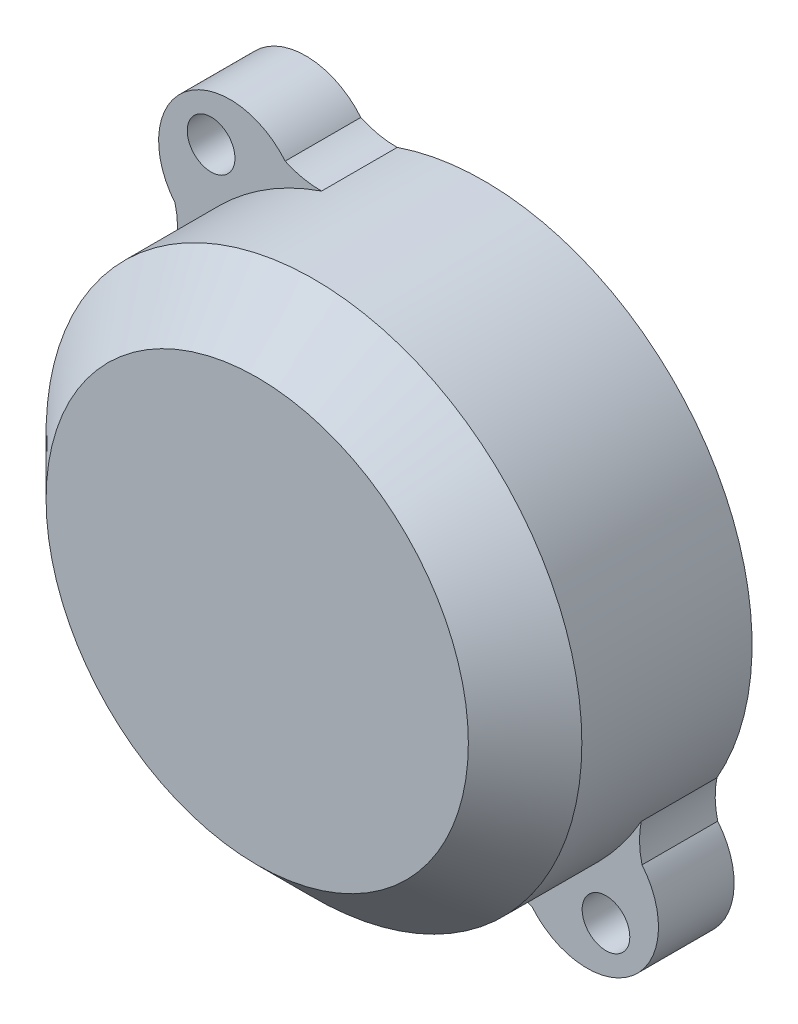
ISO-10303-21;
HEADER;
FILE_DESCRIPTION(('STEP AP214'),'2;1');
FILE_NAME('part.step','',(''),(''),'','','');
FILE_SCHEMA(('AUTOMOTIVE_DESIGN { 1 0 10303 214 1 1 1 1 }'));
ENDSEC;
DATA;
#1=APPLICATION_CONTEXT('core data for automotive mechanical design processes');
#2=APPLICATION_PROTOCOL_DEFINITION('international standard','automotive_design',2000,#1);
#3=PRODUCT_CONTEXT('',#1,'mechanical');
#4=PRODUCT('Part','Part','',(#3));
#5=PRODUCT_RELATED_PRODUCT_CATEGORY('part','',(#4));
#6=PRODUCT_DEFINITION_FORMATION('','',#4);
#7=PRODUCT_DEFINITION_CONTEXT('part definition',#1,'design');
#8=PRODUCT_DEFINITION('design','',#6,#7);
#9=PRODUCT_DEFINITION_SHAPE('','',#8);
#10=(LENGTH_UNIT() NAMED_UNIT(*) SI_UNIT(.MILLI.,.METRE.));
#11=(NAMED_UNIT(*) PLANE_ANGLE_UNIT() SI_UNIT($,.RADIAN.));
#12=(NAMED_UNIT(*) SI_UNIT($,.STERADIAN.) SOLID_ANGLE_UNIT());
#13=UNCERTAINTY_MEASURE_WITH_UNIT(LENGTH_MEASURE(1.E-05),#10,'distance_accuracy_value','');
#14=(GEOMETRIC_REPRESENTATION_CONTEXT(3) GLOBAL_UNCERTAINTY_ASSIGNED_CONTEXT((#13)) GLOBAL_UNIT_ASSIGNED_CONTEXT((#10,
#11,#12)) REPRESENTATION_CONTEXT('',''));
#15=CARTESIAN_POINT('',(0.,0.,0.));
#16=DIRECTION('',(0.,0.,1.));
#17=DIRECTION('',(1.,0.,0.));
#18=AXIS2_PLACEMENT_3D('',#15,#16,#17);
#19=CARTESIAN_POINT('',(-167.581326330583,1325.78958983772,-940.799406281006));
#20=DIRECTION('',(0.,0.,-1.));
#21=DIRECTION('',(-1.,0.,0.));
#22=AXIS2_PLACEMENT_3D('',#19,#20,#21);
#23=CYLINDRICAL_SURFACE('',#22,22.4820000000628);
#24=CARTESIAN_POINT('',(-167.581326330583,1325.78958983772,-945.561906281006));
#25=DIRECTION('',(0.,0.,1.));
#26=DIRECTION('',(1.,0.,0.));
#27=AXIS2_PLACEMENT_3D('',#24,#25,#26);
#28=CIRCLE('',#27,22.4820000000628);
#29=CARTESIAN_POINT('',(-145.09932633052,1325.78958983772,-945.561906281006));
#30=VERTEX_POINT('',#29);
#31=EDGE_CURVE('E11',#30,#30,#28,.F.);
#32=ORIENTED_EDGE('',*,*,#31,.T.);
#33=EDGE_LOOP('',(#32));
#34=FACE_BOUND('',#33,.T.);
#35=CARTESIAN_POINT('',(-167.581326330583,1325.78958983772,-959.849406281006));
#36=DIRECTION('',(0.,0.,1.));
#37=DIRECTION('',(1.,0.,0.));
#38=AXIS2_PLACEMENT_3D('',#35,#36,#37);
#39=CIRCLE('',#38,22.4820000000628);
#40=CARTESIAN_POINT('',(-187.111667421784,1336.9253924969,-959.849406281006));
#41=VERTEX_POINT('',#40);
#42=CARTESIAN_POINT('',(-160.283886838188,1304.52488431759,-959.849406281006));
#43=VERTEX_POINT('',#42);
#44=EDGE_CURVE('E360',#41,#43,#39,.T.);
#45=ORIENTED_EDGE('',*,*,#44,.T.);
#46=DIRECTION('',(0.,0.,-1.));
#47=VECTOR('',#46,1.);
#48=CARTESIAN_POINT('',(-160.283886838188,1304.52488431759,-953.499406281006));
#49=LINE('',#48,#47);
#50=CARTESIAN_POINT('',(-160.283886838188,1304.52488431759,-953.499406281006));
#51=VERTEX_POINT('',#50);
#52=EDGE_CURVE('E304',#51,#43,#49,.T.);
#53=ORIENTED_EDGE('',*,*,#52,.F.);
#54=CARTESIAN_POINT('',(-167.581326330583,1325.78958983772,-953.499406281006));
#55=DIRECTION('',(0.,0.,1.));
#56=DIRECTION('',(1.,0.,0.));
#57=AXIS2_PLACEMENT_3D('',#54,#55,#56);
#58=CIRCLE('',#57,22.4820000000628);
#59=CARTESIAN_POINT('',(-148.050985239385,1314.65378717853,-953.499406281006));
#60=VERTEX_POINT('',#59);
#61=EDGE_CURVE('E71',#51,#60,#58,.T.);
#62=ORIENTED_EDGE('',*,*,#61,.T.);
#63=DIRECTION('',(0.,0.,-1.));
#64=VECTOR('',#63,1.);
#65=CARTESIAN_POINT('',(-148.050985239385,1314.65378717853,-953.499406281006));
#66=LINE('',#65,#64);
#67=CARTESIAN_POINT('',(-148.050985239385,1314.65378717853,-959.849406281006));
#68=VERTEX_POINT('',#67);
#69=EDGE_CURVE('E316',#60,#68,#66,.T.);
#70=ORIENTED_EDGE('',*,*,#69,.T.);
#71=CARTESIAN_POINT('',(-174.878765822976,1347.05429535784,-959.849406281006));
#72=VERTEX_POINT('',#71);
#73=EDGE_CURVE('E359',#68,#72,#39,.T.);
#74=ORIENTED_EDGE('',*,*,#73,.T.);
#75=DIRECTION('',(0.,0.,-1.));
#76=VECTOR('',#75,1.);
#77=CARTESIAN_POINT('',(-174.878765822976,1347.05429535784,-953.499406281006));
#78=LINE('',#77,#76);
#79=CARTESIAN_POINT('',(-174.878765822976,1347.05429535784,-953.499406281006));
#80=VERTEX_POINT('',#79);
#81=EDGE_CURVE('E339',#80,#72,#78,.T.);
#82=ORIENTED_EDGE('',*,*,#81,.F.);
#83=CARTESIAN_POINT('',(-167.581326330583,1325.78958983772,-953.499406281006));
#84=DIRECTION('',(0.,0.,1.));
#85=DIRECTION('',(1.,0.,0.));
#86=AXIS2_PLACEMENT_3D('',#83,#84,#85);
#87=CIRCLE('',#86,22.4820000000628);
#88=CARTESIAN_POINT('',(-187.111667421784,1336.9253924969,-953.499406281006));
#89=VERTEX_POINT('',#88);
#90=EDGE_CURVE('E334',#80,#89,#87,.T.);
#91=ORIENTED_EDGE('',*,*,#90,.T.);
#92=DIRECTION('',(0.,0.,-1.));
#93=VECTOR('',#92,1.);
#94=CARTESIAN_POINT('',(-187.111667421784,1336.9253924969,-953.499406281006));
#95=LINE('',#94,#93);
#96=EDGE_CURVE('E352',#89,#41,#95,.T.);
#97=ORIENTED_EDGE('',*,*,#96,.T.);
#98=EDGE_LOOP('',(#45,#53,#62,#70,#74,#82,#91,#97));
#99=FACE_BOUND('',#98,.T.);
#100=ADVANCED_FACE('F47',(#34,#99),#23,.T.);
#101=CARTESIAN_POINT('',(0.,0.,-940.799406281006));
#102=DIRECTION('',(0.,0.,1.));
#103=DIRECTION('',(1.,0.,0.));
#104=AXIS2_PLACEMENT_3D('',#101,#102,#103);
#105=PLANE('',#104);
#106=CARTESIAN_POINT('',(-167.581326330583,1325.78958983772,-940.799406281006));
#107=DIRECTION('',(0.,0.,1.));
#108=DIRECTION('',(1.,0.,0.));
#109=AXIS2_PLACEMENT_3D('',#106,#107,#108);
#110=CIRCLE('',#109,17.7195000000628);
#111=CARTESIAN_POINT('',(-149.86182633052,1325.78958983772,-940.799406281006));
#112=VERTEX_POINT('',#111);
#113=EDGE_CURVE('E56',#112,#112,#110,.T.);
#114=ORIENTED_EDGE('',*,*,#113,.T.);
#115=EDGE_LOOP('',(#114));
#116=FACE_BOUND('',#115,.T.);
#117=ADVANCED_FACE('F364',(#116),#105,.T.);
#118=CARTESIAN_POINT('',(0.,0.,-959.849406281006));
#119=DIRECTION('',(0.,0.,1.));
#120=DIRECTION('',(1.,0.,0.));
#121=AXIS2_PLACEMENT_3D('',#118,#119,#120);
#122=PLANE('',#121);
#123=CARTESIAN_POINT('',(-182.557185770616,1343.87626885937,-959.849406281006));
#124=DIRECTION('',(0.,0.,1.));
#125=DIRECTION('',(1.,0.,0.));
#126=AXIS2_PLACEMENT_3D('',#123,#124,#125);
#127=CIRCLE('',#126,3.99999993600104);
#128=CARTESIAN_POINT('',(-185.382666181313,1341.04489817775,-959.849406281006));
#129=VERTEX_POINT('',#128);
#130=CARTESIAN_POINT('',(-186.281027508607,1342.41578873339,-959.849406281006));
#131=VERTEX_POINT('',#130);
#132=EDGE_CURVE('E263',#129,#131,#127,.F.);
#133=ORIENTED_EDGE('',*,*,#132,.F.);
#134=CARTESIAN_POINT('',(-193.962425640702,1338.3415036593,-959.849406281006));
#135=DIRECTION('',(0.,0.,1.));
#136=DIRECTION('',(1.,0.,0.));
#137=AXIS2_PLACEMENT_3D('',#134,#135,#136);
#138=CIRCLE('',#137,8.99558860238387);
#139=CARTESIAN_POINT('',(-185.229107010828,1336.18517344052,-959.849406281006));
#140=VERTEX_POINT('',#139);
#141=EDGE_CURVE('E260',#129,#140,#138,.F.);
#142=ORIENTED_EDGE('',*,*,#141,.T.);
#143=CARTESIAN_POINT('',(-167.581326330583,1325.78958983772,-959.849406281006));
#144=DIRECTION('',(0.,0.,1.));
#145=DIRECTION('',(1.,0.,0.));
#146=AXIS2_PLACEMENT_3D('',#143,#144,#145);
#147=CIRCLE('',#146,20.4819999360628);
#148=CARTESIAN_POINT('',(-160.659967324363,1306.5124761822,-959.849406281006));
#149=VERTEX_POINT('',#148);
#150=EDGE_CURVE('E258',#140,#149,#147,.T.);
#151=ORIENTED_EDGE('',*,*,#150,.T.);
#152=CARTESIAN_POINT('',(-160.170477426892,1297.53021511142,-959.849406281006));
#153=DIRECTION('',(0.,0.,1.));
#154=DIRECTION('',(1.,0.,0.));
#155=AXIS2_PLACEMENT_3D('',#152,#153,#154);
#156=CIRCLE('',#155,8.99558860238443);
#157=CARTESIAN_POINT('',(-155.91417409477,1305.45514389648,-959.849406281006));
#158=VERTEX_POINT('',#157);
#159=EDGE_CURVE('E194',#158,#149,#156,.T.);
#160=ORIENTED_EDGE('',*,*,#159,.F.);
#161=CARTESIAN_POINT('',(-152.605466890552,1307.70291081606,-959.849406281006));
#162=DIRECTION('',(0.,0.,1.));
#163=DIRECTION('',(1.,0.,0.));
#164=AXIS2_PLACEMENT_3D('',#161,#162,#163);
#165=CIRCLE('',#164,3.99999993600011);
#166=CARTESIAN_POINT('',(-154.734911112859,1304.31684129638,-959.849406281006));
#167=VERTEX_POINT('',#166);
#168=EDGE_CURVE('E277',#158,#167,#165,.T.);
#169=ORIENTED_EDGE('',*,*,#168,.T.);
#170=CARTESIAN_POINT('',(-151.011069113528,1305.77732110674,-959.849406281006));
#171=DIRECTION('',(0.,0.,1.));
#172=DIRECTION('',(1.,0.,0.));
#173=AXIS2_PLACEMENT_3D('',#170,#171,#172);
#174=CIRCLE('',#173,4.00000006405684);
#175=CARTESIAN_POINT('',(-148.881625152563,1309.16339094205,-959.849406281006));
#176=VERTEX_POINT('',#175);
#177=EDGE_CURVE('E211',#167,#176,#174,.F.);
#178=ORIENTED_EDGE('',*,*,#177,.T.);
#179=CARTESIAN_POINT('',(-149.779986479852,1310.53428149768,-959.849406281006));
#180=VERTEX_POINT('',#179);
#181=EDGE_CURVE('E274',#176,#180,#165,.T.);
#182=ORIENTED_EDGE('',*,*,#181,.T.);
#183=CARTESIAN_POINT('',(-141.200227020465,1313.23767601614,-959.849406281006));
#184=DIRECTION('',(0.,0.,1.));
#185=DIRECTION('',(1.,0.,0.));
#186=AXIS2_PLACEMENT_3D('',#183,#184,#185);
#187=CIRCLE('',#186,8.99558860238392);
#188=CARTESIAN_POINT('',(-149.933545650341,1315.39400623491,-959.849406281006));
#189=VERTEX_POINT('',#188);
#190=EDGE_CURVE('E271',#180,#189,#187,.F.);
#191=ORIENTED_EDGE('',*,*,#190,.T.);
#192=CARTESIAN_POINT('',(-167.581326330583,1325.78958983772,-959.849406281006));
#193=DIRECTION('',(0.,0.,1.));
#194=DIRECTION('',(1.,0.,0.));
#195=AXIS2_PLACEMENT_3D('',#192,#193,#194);
#196=CIRCLE('',#195,20.4819999360628);
#197=CARTESIAN_POINT('',(-174.502685336801,1345.06670349324,-959.849406281006));
#198=VERTEX_POINT('',#197);
#199=EDGE_CURVE('E236',#189,#198,#196,.T.);
#200=ORIENTED_EDGE('',*,*,#199,.T.);
#201=CARTESIAN_POINT('',(-174.992175234277,1354.04896456402,-959.849406281006));
#202=DIRECTION('',(0.,0.,1.));
#203=DIRECTION('',(1.,0.,0.));
#204=AXIS2_PLACEMENT_3D('',#201,#202,#203);
#205=CIRCLE('',#204,8.99558860238344);
#206=CARTESIAN_POINT('',(-179.248478566398,1346.12403577895,-959.849406281006));
#207=VERTEX_POINT('',#206);
#208=EDGE_CURVE('E250',#207,#198,#205,.T.);
#209=ORIENTED_EDGE('',*,*,#208,.F.);
#210=CARTESIAN_POINT('',(-180.427741548311,1347.26233837905,-959.849406281006));
#211=VERTEX_POINT('',#210);
#212=EDGE_CURVE('E266',#211,#207,#127,.F.);
#213=ORIENTED_EDGE('',*,*,#212,.F.);
#214=CARTESIAN_POINT('',(-184.15158354764,1345.80185856869,-959.849406281006));
#215=DIRECTION('',(0.,0.,1.));
#216=DIRECTION('',(1.,0.,0.));
#217=AXIS2_PLACEMENT_3D('',#214,#215,#216);
#218=CIRCLE('',#217,4.00000006405531);
#219=EDGE_CURVE('E241',#131,#211,#218,.T.);
#220=ORIENTED_EDGE('',*,*,#219,.F.);
#221=EDGE_LOOP('',(#133,#142,#151,#160,#169,#178,#182,#191,#200,#209,#213,#220));
#222=FACE_BOUND('',#221,.T.);
#223=ORIENTED_EDGE('',*,*,#44,.F.);
#224=CARTESIAN_POINT('',(-193.962425640702,1338.3415036593,-959.849406281006));
#225=DIRECTION('',(0.,0.,1.));
#226=DIRECTION('',(1.,0.,0.));
#227=AXIS2_PLACEMENT_3D('',#224,#225,#226);
#228=CIRCLE('',#227,6.99558853838387);
#229=CARTESIAN_POINT('',(-187.178601072973,1340.04971419451,-959.849406281006));
#230=VERTEX_POINT('',#229);
#231=EDGE_CURVE('E345',#230,#41,#228,.F.);
#232=ORIENTED_EDGE('',*,*,#231,.F.);
#233=CARTESIAN_POINT('',(-182.557185770616,1343.87626885937,-959.849406281006));
#234=DIRECTION('',(0.,0.,1.));
#235=DIRECTION('',(1.,0.,0.));
#236=AXIS2_PLACEMENT_3D('',#233,#234,#235);
#237=CIRCLE('',#236,6.00000000000104);
#238=CARTESIAN_POINT('',(-177.935770468258,1347.70282352423,-959.849406281006));
#239=VERTEX_POINT('',#238);
#240=EDGE_CURVE('E342',#230,#239,#237,.F.);
#241=ORIENTED_EDGE('',*,*,#240,.T.);
#242=CARTESIAN_POINT('',(-174.992175234277,1354.04896456402,-959.849406281006));
#243=DIRECTION('',(0.,0.,1.));
#244=DIRECTION('',(1.,0.,0.));
#245=AXIS2_PLACEMENT_3D('',#242,#243,#244);
#246=CIRCLE('',#245,6.99558853838344);
#247=EDGE_CURVE('E323',#239,#72,#246,.T.);
#248=ORIENTED_EDGE('',*,*,#247,.T.);
#249=ORIENTED_EDGE('',*,*,#73,.F.);
#250=CARTESIAN_POINT('',(-141.200227020465,1313.23767601614,-959.849406281006));
#251=DIRECTION('',(0.,0.,1.));
#252=DIRECTION('',(1.,0.,0.));
#253=AXIS2_PLACEMENT_3D('',#250,#251,#252);
#254=CIRCLE('',#253,6.99558853838392);
#255=CARTESIAN_POINT('',(-147.984051588195,1311.52946548092,-959.849406281006));
#256=VERTEX_POINT('',#255);
#257=EDGE_CURVE('E309',#256,#68,#254,.F.);
#258=ORIENTED_EDGE('',*,*,#257,.F.);
#259=CARTESIAN_POINT('',(-152.605466890552,1307.70291081606,-959.849406281006));
#260=DIRECTION('',(0.,0.,1.));
#261=DIRECTION('',(1.,0.,0.));
#262=AXIS2_PLACEMENT_3D('',#259,#260,#261);
#263=CIRCLE('',#262,6.00000000000011);
#264=CARTESIAN_POINT('',(-157.226882192909,1303.8763561512,-959.849406281006));
#265=VERTEX_POINT('',#264);
#266=EDGE_CURVE('E307',#265,#256,#263,.T.);
#267=ORIENTED_EDGE('',*,*,#266,.F.);
#268=CARTESIAN_POINT('',(-160.170477426892,1297.53021511142,-959.849406281006));
#269=DIRECTION('',(0.,0.,1.));
#270=DIRECTION('',(1.,0.,0.));
#271=AXIS2_PLACEMENT_3D('',#268,#269,#270);
#272=CIRCLE('',#271,6.99558853838443);
#273=EDGE_CURVE('E291',#265,#43,#272,.T.);
#274=ORIENTED_EDGE('',*,*,#273,.T.);
#275=EDGE_LOOP('',(#223,#232,#241,#248,#249,#258,#267,#274));
#276=FACE_BOUND('',#275,.T.);
#277=CARTESIAN_POINT('',(-184.15158354764,1345.80185856869,-959.849406281006));
#278=DIRECTION('',(0.,0.,1.));
#279=DIRECTION('',(1.,0.,0.));
#280=AXIS2_PLACEMENT_3D('',#277,#278,#279);
#281=CIRCLE('',#280,2.00000000005531);
#282=CARTESIAN_POINT('',(-182.151583547584,1345.80185856869,-959.849406281006));
#283=VERTEX_POINT('',#282);
#284=EDGE_CURVE('E328',#283,#283,#281,.T.);
#285=ORIENTED_EDGE('',*,*,#284,.T.);
#286=EDGE_LOOP('',(#285));
#287=FACE_BOUND('',#286,.T.);
#288=CARTESIAN_POINT('',(-151.011069113528,1305.77732110674,-959.849406281006));
#289=DIRECTION('',(0.,0.,1.));
#290=DIRECTION('',(1.,0.,0.));
#291=AXIS2_PLACEMENT_3D('',#288,#289,#290);
#292=CIRCLE('',#291,2.00000000005684);
#293=CARTESIAN_POINT('',(-149.011069113471,1305.77732110674,-959.849406281006));
#294=VERTEX_POINT('',#293);
#295=EDGE_CURVE('E296',#294,#294,#292,.F.);
#296=ORIENTED_EDGE('',*,*,#295,.F.);
#297=EDGE_LOOP('',(#296));
#298=FACE_BOUND('',#297,.T.);
#299=ADVANCED_FACE('F388',(#222,#276,#287,#298),#122,.F.);
#300=CARTESIAN_POINT('',(-174.992175234277,1354.04896456402,-953.499406281006));
#301=DIRECTION('',(0.,0.,-1.));
#302=DIRECTION('',(-1.,0.,0.));
#303=AXIS2_PLACEMENT_3D('',#300,#301,#302);
#304=CYLINDRICAL_SURFACE('',#303,6.99558853838344);
#305=ORIENTED_EDGE('',*,*,#247,.F.);
#306=DIRECTION('',(0.,0.,-1.));
#307=VECTOR('',#306,1.);
#308=CARTESIAN_POINT('',(-177.935770468258,1347.70282352423,-953.499406281006));
#309=LINE('',#308,#307);
#310=CARTESIAN_POINT('',(-177.935770468258,1347.70282352423,-953.499406281006));
#311=VERTEX_POINT('',#310);
#312=EDGE_CURVE('E357',#311,#239,#309,.T.);
#313=ORIENTED_EDGE('',*,*,#312,.F.);
#314=CARTESIAN_POINT('',(-174.992175234277,1354.04896456402,-953.499406281006));
#315=DIRECTION('',(0.,0.,1.));
#316=DIRECTION('',(1.,0.,0.));
#317=AXIS2_PLACEMENT_3D('',#314,#315,#316);
#318=CIRCLE('',#317,6.99558853838344);
#319=EDGE_CURVE('E324',#311,#80,#318,.T.);
#320=ORIENTED_EDGE('',*,*,#319,.T.);
#321=ORIENTED_EDGE('',*,*,#81,.T.);
#322=EDGE_LOOP('',(#305,#313,#320,#321));
#323=FACE_BOUND('',#322,.T.);
#324=ADVANCED_FACE('F391',(#323),#304,.F.);
#325=CARTESIAN_POINT('',(-182.557185770616,1343.87626885937,-953.499406281006));
#326=DIRECTION('',(0.,0.,-1.));
#327=DIRECTION('',(-1.,0.,0.));
#328=AXIS2_PLACEMENT_3D('',#325,#326,#327);
#329=CYLINDRICAL_SURFACE('',#328,6.00000000000104);
#330=ORIENTED_EDGE('',*,*,#240,.F.);
#331=DIRECTION('',(0.,0.,-1.));
#332=VECTOR('',#331,1.);
#333=CARTESIAN_POINT('',(-187.178601072973,1340.04971419451,-953.499406281006));
#334=LINE('',#333,#332);
#335=CARTESIAN_POINT('',(-187.178601072973,1340.04971419451,-953.499406281006));
#336=VERTEX_POINT('',#335);
#337=EDGE_CURVE('E355',#336,#230,#334,.T.);
#338=ORIENTED_EDGE('',*,*,#337,.F.);
#339=CARTESIAN_POINT('',(-182.557185770616,1343.87626885937,-953.499406281006));
#340=DIRECTION('',(0.,0.,1.));
#341=DIRECTION('',(1.,0.,0.));
#342=AXIS2_PLACEMENT_3D('',#339,#340,#341);
#343=CIRCLE('',#342,6.00000000000104);
#344=EDGE_CURVE('E327',#336,#311,#343,.F.);
#345=ORIENTED_EDGE('',*,*,#344,.T.);
#346=ORIENTED_EDGE('',*,*,#312,.T.);
#347=EDGE_LOOP('',(#330,#338,#345,#346));
#348=FACE_BOUND('',#347,.T.);
#349=ADVANCED_FACE('F396',(#348),#329,.T.);
#350=CARTESIAN_POINT('',(-193.962425640702,1338.3415036593,-953.499406281006));
#351=DIRECTION('',(0.,0.,-1.));
#352=DIRECTION('',(-1.,0.,0.));
#353=AXIS2_PLACEMENT_3D('',#350,#351,#352);
#354=CYLINDRICAL_SURFACE('',#353,6.99558853838387);
#355=ORIENTED_EDGE('',*,*,#231,.T.);
#356=ORIENTED_EDGE('',*,*,#96,.F.);
#357=CARTESIAN_POINT('',(-193.962425640702,1338.3415036593,-953.499406281006));
#358=DIRECTION('',(0.,0.,1.));
#359=DIRECTION('',(1.,0.,0.));
#360=AXIS2_PLACEMENT_3D('',#357,#358,#359);
#361=CIRCLE('',#360,6.99558853838387);
#362=EDGE_CURVE('E331',#336,#89,#361,.F.);
#363=ORIENTED_EDGE('',*,*,#362,.F.);
#364=ORIENTED_EDGE('',*,*,#337,.T.);
#365=EDGE_LOOP('',(#355,#356,#363,#364));
#366=FACE_BOUND('',#365,.T.);
#367=ADVANCED_FACE('F400',(#366),#354,.F.);
#368=CARTESIAN_POINT('',(-184.15158354764,1345.80185856869,-953.499406281006));
#369=DIRECTION('',(0.,0.,-1.));
#370=DIRECTION('',(-1.,0.,0.));
#371=AXIS2_PLACEMENT_3D('',#368,#369,#370);
#372=CYLINDRICAL_SURFACE('',#371,2.00000000005531);
#373=CARTESIAN_POINT('',(-184.15158354764,1345.80185856869,-953.499406281006));
#374=DIRECTION('',(0.,0.,1.));
#375=DIRECTION('',(1.,0.,0.));
#376=AXIS2_PLACEMENT_3D('',#373,#374,#375);
#377=CIRCLE('',#376,2.00000000005531);
#378=CARTESIAN_POINT('',(-182.151583547584,1345.80185856869,-953.499406281006));
#379=VERTEX_POINT('',#378);
#380=EDGE_CURVE('E336',#379,#379,#377,.T.);
#381=ORIENTED_EDGE('',*,*,#380,.T.);
#382=EDGE_LOOP('',(#381));
#383=FACE_BOUND('',#382,.T.);
#384=ORIENTED_EDGE('',*,*,#284,.F.);
#385=EDGE_LOOP('',(#384));
#386=FACE_BOUND('',#385,.T.);
#387=ADVANCED_FACE('F404',(#383,#386),#372,.F.);
#388=CARTESIAN_POINT('',(0.,0.,-953.499406281006));
#389=DIRECTION('',(0.,0.,1.));
#390=DIRECTION('',(1.,0.,0.));
#391=AXIS2_PLACEMENT_3D('',#388,#389,#390);
#392=PLANE('',#391);
#393=ORIENTED_EDGE('',*,*,#319,.F.);
#394=ORIENTED_EDGE('',*,*,#344,.F.);
#395=ORIENTED_EDGE('',*,*,#362,.T.);
#396=ORIENTED_EDGE('',*,*,#90,.F.);
#397=EDGE_LOOP('',(#393,#394,#395,#396));
#398=FACE_BOUND('',#397,.T.);
#399=ORIENTED_EDGE('',*,*,#380,.F.);
#400=EDGE_LOOP('',(#399));
#401=FACE_BOUND('',#400,.T.);
#402=ADVANCED_FACE('F408',(#398,#401),#392,.T.);
#403=CARTESIAN_POINT('',(-160.170477426892,1297.53021511142,-953.499406281006));
#404=DIRECTION('',(0.,0.,-1.));
#405=DIRECTION('',(-1.,0.,0.));
#406=AXIS2_PLACEMENT_3D('',#403,#404,#405);
#407=CYLINDRICAL_SURFACE('',#406,6.99558853838443);
#408=ORIENTED_EDGE('',*,*,#273,.F.);
#409=DIRECTION('',(0.,0.,-1.));
#410=VECTOR('',#409,1.);
#411=CARTESIAN_POINT('',(-157.226882192909,1303.8763561512,-953.499406281006));
#412=LINE('',#411,#410);
#413=CARTESIAN_POINT('',(-157.226882192909,1303.8763561512,-953.499406281006));
#414=VERTEX_POINT('',#413);
#415=EDGE_CURVE('E321',#414,#265,#412,.T.);
#416=ORIENTED_EDGE('',*,*,#415,.F.);
#417=CARTESIAN_POINT('',(-160.170477426892,1297.53021511142,-953.499406281006));
#418=DIRECTION('',(0.,0.,1.));
#419=DIRECTION('',(1.,0.,0.));
#420=AXIS2_PLACEMENT_3D('',#417,#418,#419);
#421=CIRCLE('',#420,6.99558853838443);
#422=EDGE_CURVE('E292',#414,#51,#421,.T.);
#423=ORIENTED_EDGE('',*,*,#422,.T.);
#424=ORIENTED_EDGE('',*,*,#52,.T.);
#425=EDGE_LOOP('',(#408,#416,#423,#424));
#426=FACE_BOUND('',#425,.T.);
#427=ADVANCED_FACE('F412',(#426),#407,.F.);
#428=CARTESIAN_POINT('',(-152.605466890552,1307.70291081606,-953.499406281006));
#429=DIRECTION('',(0.,0.,-1.));
#430=DIRECTION('',(-1.,0.,0.));
#431=AXIS2_PLACEMENT_3D('',#428,#429,#430);
#432=CYLINDRICAL_SURFACE('',#431,6.00000000000011);
#433=ORIENTED_EDGE('',*,*,#266,.T.);
#434=DIRECTION('',(0.,0.,-1.));
#435=VECTOR('',#434,1.);
#436=CARTESIAN_POINT('',(-147.984051588195,1311.52946548092,-953.499406281006));
#437=LINE('',#436,#435);
#438=CARTESIAN_POINT('',(-147.984051588195,1311.52946548092,-953.499406281006));
#439=VERTEX_POINT('',#438);
#440=EDGE_CURVE('E318',#439,#256,#437,.T.);
#441=ORIENTED_EDGE('',*,*,#440,.F.);
#442=CARTESIAN_POINT('',(-152.605466890552,1307.70291081606,-953.499406281006));
#443=DIRECTION('',(0.,0.,1.));
#444=DIRECTION('',(1.,0.,0.));
#445=AXIS2_PLACEMENT_3D('',#442,#443,#444);
#446=CIRCLE('',#445,6.00000000000011);
#447=EDGE_CURVE('E295',#414,#439,#446,.T.);
#448=ORIENTED_EDGE('',*,*,#447,.F.);
#449=ORIENTED_EDGE('',*,*,#415,.T.);
#450=EDGE_LOOP('',(#433,#441,#448,#449));
#451=FACE_BOUND('',#450,.T.);
#452=ADVANCED_FACE('F416',(#451),#432,.T.);
#453=CARTESIAN_POINT('',(-141.200227020465,1313.23767601614,-953.499406281006));
#454=DIRECTION('',(0.,0.,-1.));
#455=DIRECTION('',(-1.,0.,0.));
#456=AXIS2_PLACEMENT_3D('',#453,#454,#455);
#457=CYLINDRICAL_SURFACE('',#456,6.99558853838392);
#458=ORIENTED_EDGE('',*,*,#257,.T.);
#459=ORIENTED_EDGE('',*,*,#69,.F.);
#460=CARTESIAN_POINT('',(-141.200227020465,1313.23767601614,-953.499406281006));
#461=DIRECTION('',(0.,0.,1.));
#462=DIRECTION('',(1.,0.,0.));
#463=AXIS2_PLACEMENT_3D('',#460,#461,#462);
#464=CIRCLE('',#463,6.99558853838392);
#465=EDGE_CURVE('E298',#439,#60,#464,.F.);
#466=ORIENTED_EDGE('',*,*,#465,.F.);
#467=ORIENTED_EDGE('',*,*,#440,.T.);
#468=EDGE_LOOP('',(#458,#459,#466,#467));
#469=FACE_BOUND('',#468,.T.);
#470=ADVANCED_FACE('F420',(#469),#457,.F.);
#471=CARTESIAN_POINT('',(-151.011069113528,1305.77732110674,-953.499406281006));
#472=DIRECTION('',(0.,0.,-1.));
#473=DIRECTION('',(-1.,0.,0.));
#474=AXIS2_PLACEMENT_3D('',#471,#472,#473);
#475=CYLINDRICAL_SURFACE('',#474,2.00000000005684);
#476=CARTESIAN_POINT('',(-151.011069113528,1305.77732110674,-953.499406281006));
#477=DIRECTION('',(0.,0.,1.));
#478=DIRECTION('',(1.,0.,0.));
#479=AXIS2_PLACEMENT_3D('',#476,#477,#478);
#480=CIRCLE('',#479,2.00000000005684);
#481=CARTESIAN_POINT('',(-149.011069113471,1305.77732110674,-953.499406281006));
#482=VERTEX_POINT('',#481);
#483=EDGE_CURVE('E301',#482,#482,#480,.F.);
#484=ORIENTED_EDGE('',*,*,#483,.F.);
#485=EDGE_LOOP('',(#484));
#486=FACE_BOUND('',#485,.T.);
#487=ORIENTED_EDGE('',*,*,#295,.T.);
#488=EDGE_LOOP('',(#487));
#489=FACE_BOUND('',#488,.T.);
#490=ADVANCED_FACE('F380',(#486,#489),#475,.F.);
#491=CARTESIAN_POINT('',(0.,0.,-953.499406281006));
#492=DIRECTION('',(0.,0.,1.));
#493=DIRECTION('',(1.,0.,0.));
#494=AXIS2_PLACEMENT_3D('',#491,#492,#493);
#495=PLANE('',#494);
#496=ORIENTED_EDGE('',*,*,#422,.F.);
#497=ORIENTED_EDGE('',*,*,#447,.T.);
#498=ORIENTED_EDGE('',*,*,#465,.T.);
#499=ORIENTED_EDGE('',*,*,#61,.F.);
#500=EDGE_LOOP('',(#496,#497,#498,#499));
#501=FACE_BOUND('',#500,.T.);
#502=ORIENTED_EDGE('',*,*,#483,.T.);
#503=EDGE_LOOP('',(#502));
#504=FACE_BOUND('',#503,.T.);
#505=ADVANCED_FACE('F368',(#501,#504),#495,.T.);
#506=CARTESIAN_POINT('',(-167.581326330583,1325.78958983772,-940.799406281006));
#507=DIRECTION('',(0.,0.,-1.));
#508=DIRECTION('',(-1.,0.,0.));
#509=AXIS2_PLACEMENT_3D('',#506,#507,#508);
#510=CONICAL_SURFACE('',#509,17.7195000000628,0.785398163397447);
#511=ORIENTED_EDGE('',*,*,#31,.F.);
#512=EDGE_LOOP('',(#511));
#513=FACE_BOUND('',#512,.T.);
#514=ORIENTED_EDGE('',*,*,#113,.F.);
#515=EDGE_LOOP('',(#514));
#516=FACE_BOUND('',#515,.T.);
#517=ADVANCED_FACE('F50',(#513,#516),#510,.T.);
#518=CARTESIAN_POINT('',(-182.557185770616,1343.87626885937,-953.499406281006));
#519=DIRECTION('',(0.,0.,-1.));
#520=DIRECTION('',(-1.,0.,0.));
#521=AXIS2_PLACEMENT_3D('',#518,#519,#520);
#522=CYLINDRICAL_SURFACE('',#521,3.99999993600104);
#523=ORIENTED_EDGE('',*,*,#212,.T.);
#524=DIRECTION('',(0.,0.,-1.));
#525=VECTOR('',#524,1.);
#526=CARTESIAN_POINT('',(-179.248478566398,1346.12403577895,-955.499406345006));
#527=LINE('',#526,#525);
#528=CARTESIAN_POINT('',(-179.248478566398,1346.12403577895,-955.499406345006));
#529=VERTEX_POINT('',#528);
#530=EDGE_CURVE('E233',#529,#207,#527,.T.);
#531=ORIENTED_EDGE('',*,*,#530,.F.);
#532=CARTESIAN_POINT('',(-182.557185770616,1343.87626885937,-955.499406345006));
#533=DIRECTION('',(0.,0.,1.));
#534=DIRECTION('',(1.,0.,0.));
#535=AXIS2_PLACEMENT_3D('',#532,#533,#534);
#536=CIRCLE('',#535,3.99999993600104);
#537=CARTESIAN_POINT('',(-180.427741548311,1347.26233837905,-955.499406345006));
#538=VERTEX_POINT('',#537);
#539=EDGE_CURVE('E243',#538,#529,#536,.F.);
#540=ORIENTED_EDGE('',*,*,#539,.F.);
#541=DIRECTION('',(0.,0.,-1.));
#542=VECTOR('',#541,1.);
#543=CARTESIAN_POINT('',(-180.427741548311,1347.26233837905,-953.499406281006));
#544=LINE('',#543,#542);
#545=EDGE_CURVE('E289',#211,#538,#544,.F.);
#546=ORIENTED_EDGE('',*,*,#545,.F.);
#547=EDGE_LOOP('',(#523,#531,#540,#546));
#548=FACE_BOUND('',#547,.T.);
#549=ADVANCED_FACE('F367',(#548),#522,.F.);
#550=CARTESIAN_POINT('',(-152.605466890552,1307.70291081606,-953.499406281006));
#551=DIRECTION('',(0.,0.,-1.));
#552=DIRECTION('',(-1.,0.,0.));
#553=AXIS2_PLACEMENT_3D('',#550,#551,#552);
#554=CYLINDRICAL_SURFACE('',#553,3.99999993600011);
#555=DIRECTION('',(0.,0.,-1.));
#556=VECTOR('',#555,1.);
#557=CARTESIAN_POINT('',(-148.881625152563,1309.16339094205,-953.499406281006));
#558=LINE('',#557,#556);
#559=CARTESIAN_POINT('',(-148.881625152563,1309.16339094205,-955.499406345006));
#560=VERTEX_POINT('',#559);
#561=EDGE_CURVE('E285',#176,#560,#558,.F.);
#562=ORIENTED_EDGE('',*,*,#561,.T.);
#563=CARTESIAN_POINT('',(-152.605466890552,1307.70291081606,-955.499406345006));
#564=DIRECTION('',(0.,0.,1.));
#565=DIRECTION('',(1.,0.,0.));
#566=AXIS2_PLACEMENT_3D('',#563,#564,#565);
#567=CIRCLE('',#566,3.99999993600011);
#568=CARTESIAN_POINT('',(-149.779986479852,1310.53428149768,-955.499406345006));
#569=VERTEX_POINT('',#568);
#570=EDGE_CURVE('E210',#560,#569,#567,.T.);
#571=ORIENTED_EDGE('',*,*,#570,.T.);
#572=DIRECTION('',(0.,0.,-1.));
#573=VECTOR('',#572,1.);
#574=CARTESIAN_POINT('',(-149.779986479852,1310.53428149768,-955.499406345006));
#575=LINE('',#574,#573);
#576=EDGE_CURVE('E224',#569,#180,#575,.T.);
#577=ORIENTED_EDGE('',*,*,#576,.T.);
#578=ORIENTED_EDGE('',*,*,#181,.F.);
#579=EDGE_LOOP('',(#562,#571,#577,#578));
#580=FACE_BOUND('',#579,.T.);
#581=ADVANCED_FACE('F375',(#580),#554,.F.);
#582=CARTESIAN_POINT('',(-167.581326330583,1325.78958983772,-940.799406281006));
#583=DIRECTION('',(0.,0.,-1.));
#584=DIRECTION('',(-1.,0.,0.));
#585=AXIS2_PLACEMENT_3D('',#582,#583,#584);
#586=CYLINDRICAL_SURFACE('',#585,20.4819999360628);
#587=CARTESIAN_POINT('',(-167.581326330583,1325.78958983772,-946.390333432262));
#588=DIRECTION('',(0.,0.,-1.));
#589=DIRECTION('',(-1.,0.,0.));
#590=AXIS2_PLACEMENT_3D('',#587,#588,#589);
#591=CIRCLE('',#590,20.4819999360628);
#592=CARTESIAN_POINT('',(-188.063326266646,1325.78958983772,-946.390333432262));
#593=VERTEX_POINT('',#592);
#594=EDGE_CURVE('E257',#593,#593,#591,.T.);
#595=ORIENTED_EDGE('',*,*,#594,.F.);
#596=EDGE_LOOP('',(#595));
#597=FACE_BOUND('',#596,.T.);
#598=ORIENTED_EDGE('',*,*,#150,.F.);
#599=DIRECTION('',(0.,0.,-1.));
#600=VECTOR('',#599,1.);
#601=CARTESIAN_POINT('',(-185.229107010828,1336.18517344052,-955.499406345006));
#602=LINE('',#601,#600);
#603=CARTESIAN_POINT('',(-185.229107010828,1336.18517344052,-955.499406345006));
#604=VERTEX_POINT('',#603);
#605=EDGE_CURVE('E63',#604,#140,#602,.T.);
#606=ORIENTED_EDGE('',*,*,#605,.F.);
#607=CARTESIAN_POINT('',(-167.581326330583,1325.78958983772,-955.499406345006));
#608=DIRECTION('',(0.,0.,1.));
#609=DIRECTION('',(1.,0.,0.));
#610=AXIS2_PLACEMENT_3D('',#607,#608,#609);
#611=CIRCLE('',#610,20.4819999360628);
#612=CARTESIAN_POINT('',(-174.502685336801,1345.06670349324,-955.499406345006));
#613=VERTEX_POINT('',#612);
#614=EDGE_CURVE('E228',#613,#604,#611,.T.);
#615=ORIENTED_EDGE('',*,*,#614,.F.);
#616=DIRECTION('',(0.,0.,-1.));
#617=VECTOR('',#616,1.);
#618=CARTESIAN_POINT('',(-174.502685336801,1345.06670349324,-955.499406345006));
#619=LINE('',#618,#617);
#620=EDGE_CURVE('E225',#613,#198,#619,.T.);
#621=ORIENTED_EDGE('',*,*,#620,.T.);
#622=ORIENTED_EDGE('',*,*,#199,.F.);
#623=DIRECTION('',(0.,0.,-1.));
#624=VECTOR('',#623,1.);
#625=CARTESIAN_POINT('',(-149.933545650341,1315.39400623491,-955.499406345006));
#626=LINE('',#625,#624);
#627=CARTESIAN_POINT('',(-149.933545650341,1315.39400623491,-955.499406345006));
#628=VERTEX_POINT('',#627);
#629=EDGE_CURVE('E198',#628,#189,#626,.T.);
#630=ORIENTED_EDGE('',*,*,#629,.F.);
#631=CARTESIAN_POINT('',(-167.581326330583,1325.78958983772,-955.499406345006));
#632=DIRECTION('',(0.,0.,1.));
#633=DIRECTION('',(1.,0.,0.));
#634=AXIS2_PLACEMENT_3D('',#631,#632,#633);
#635=CIRCLE('',#634,20.4819999360628);
#636=CARTESIAN_POINT('',(-160.659967324363,1306.5124761822,-955.499406345006));
#637=VERTEX_POINT('',#636);
#638=EDGE_CURVE('E205',#637,#628,#635,.T.);
#639=ORIENTED_EDGE('',*,*,#638,.F.);
#640=DIRECTION('',(0.,0.,-1.));
#641=VECTOR('',#640,1.);
#642=CARTESIAN_POINT('',(-160.659967324363,1306.5124761822,-955.499406345006));
#643=LINE('',#642,#641);
#644=EDGE_CURVE('E188',#637,#149,#643,.T.);
#645=ORIENTED_EDGE('',*,*,#644,.T.);
#646=EDGE_LOOP('',(#598,#606,#615,#621,#622,#630,#639,#645));
#647=FACE_BOUND('',#646,.T.);
#648=ADVANCED_FACE('F214',(#597,#647),#586,.F.);
#649=CARTESIAN_POINT('',(0.,0.,-942.799406345006));
#650=DIRECTION('',(0.,0.,1.));
#651=DIRECTION('',(1.,0.,0.));
#652=AXIS2_PLACEMENT_3D('',#649,#650,#651);
#653=PLANE('',#652);
#654=CARTESIAN_POINT('',(-167.581326330583,1325.78958983772,-942.799406345006));
#655=DIRECTION('',(0.,0.,1.));
#656=DIRECTION('',(1.,0.,0.));
#657=AXIS2_PLACEMENT_3D('',#654,#655,#656);
#658=CIRCLE('',#657,16.8910728488069);
#659=CARTESIAN_POINT('',(-150.690253481776,1325.78958983772,-942.799406345006));
#660=VERTEX_POINT('',#659);
#661=EDGE_CURVE('E254',#660,#660,#658,.T.);
#662=ORIENTED_EDGE('',*,*,#661,.F.);
#663=EDGE_LOOP('',(#662));
#664=FACE_BOUND('',#663,.T.);
#665=ADVANCED_FACE('F464',(#664),#653,.F.);
#666=CARTESIAN_POINT('',(-174.992175234277,1354.04896456402,-953.499406281006));
#667=DIRECTION('',(0.,0.,-1.));
#668=DIRECTION('',(-1.,0.,0.));
#669=AXIS2_PLACEMENT_3D('',#666,#667,#668);
#670=CYLINDRICAL_SURFACE('',#669,8.99558860238344);
#671=ORIENTED_EDGE('',*,*,#208,.T.);
#672=ORIENTED_EDGE('',*,*,#620,.F.);
#673=CARTESIAN_POINT('',(-174.992175234277,1354.04896456402,-955.499406345006));
#674=DIRECTION('',(0.,0.,1.));
#675=DIRECTION('',(1.,0.,0.));
#676=AXIS2_PLACEMENT_3D('',#673,#674,#675);
#677=CIRCLE('',#676,8.99558860238344);
#678=EDGE_CURVE('E237',#529,#613,#677,.T.);
#679=ORIENTED_EDGE('',*,*,#678,.F.);
#680=ORIENTED_EDGE('',*,*,#530,.T.);
#681=EDGE_LOOP('',(#671,#672,#679,#680));
#682=FACE_BOUND('',#681,.T.);
#683=ADVANCED_FACE('F460',(#682),#670,.T.);
#684=DIRECTION('',(0.,0.,-1.));
#685=VECTOR('',#684,1.);
#686=CARTESIAN_POINT('',(-186.281027508607,1342.41578873339,-953.499406281006));
#687=LINE('',#686,#685);
#688=CARTESIAN_POINT('',(-186.281027508607,1342.41578873339,-955.499406345006));
#689=VERTEX_POINT('',#688);
#690=EDGE_CURVE('E287',#131,#689,#687,.F.);
#691=ORIENTED_EDGE('',*,*,#690,.T.);
#692=CARTESIAN_POINT('',(-185.382666181313,1341.04489817775,-955.499406345006));
#693=VERTEX_POINT('',#692);
#694=EDGE_CURVE('E240',#693,#689,#536,.F.);
#695=ORIENTED_EDGE('',*,*,#694,.F.);
#696=DIRECTION('',(0.,0.,-1.));
#697=VECTOR('',#696,1.);
#698=CARTESIAN_POINT('',(-185.382666181313,1341.04489817775,-955.499406345006));
#699=LINE('',#698,#697);
#700=EDGE_CURVE('E232',#693,#129,#699,.T.);
#701=ORIENTED_EDGE('',*,*,#700,.T.);
#702=ORIENTED_EDGE('',*,*,#132,.T.);
#703=EDGE_LOOP('',(#691,#695,#701,#702));
#704=FACE_BOUND('',#703,.T.);
#705=ADVANCED_FACE('F378',(#704),#522,.F.);
#706=CARTESIAN_POINT('',(-193.962425640702,1338.3415036593,-953.499406281006));
#707=DIRECTION('',(0.,0.,-1.));
#708=DIRECTION('',(-1.,0.,0.));
#709=AXIS2_PLACEMENT_3D('',#706,#707,#708);
#710=CYLINDRICAL_SURFACE('',#709,8.99558860238387);
#711=ORIENTED_EDGE('',*,*,#141,.F.);
#712=ORIENTED_EDGE('',*,*,#700,.F.);
#713=CARTESIAN_POINT('',(-193.962425640702,1338.3415036593,-955.499406345006));
#714=DIRECTION('',(0.,0.,1.));
#715=DIRECTION('',(1.,0.,0.));
#716=AXIS2_PLACEMENT_3D('',#713,#714,#715);
#717=CIRCLE('',#716,8.99558860238387);
#718=EDGE_CURVE('E230',#693,#604,#717,.F.);
#719=ORIENTED_EDGE('',*,*,#718,.T.);
#720=ORIENTED_EDGE('',*,*,#605,.T.);
#721=EDGE_LOOP('',(#711,#712,#719,#720));
#722=FACE_BOUND('',#721,.T.);
#723=ADVANCED_FACE('F455',(#722),#710,.T.);
#724=CARTESIAN_POINT('',(-184.15158354764,1345.80185856869,-953.499406281006));
#725=DIRECTION('',(0.,0.,-1.));
#726=DIRECTION('',(-1.,0.,0.));
#727=AXIS2_PLACEMENT_3D('',#724,#725,#726);
#728=CYLINDRICAL_SURFACE('',#727,4.00000006405531);
#729=ORIENTED_EDGE('',*,*,#545,.T.);
#730=CARTESIAN_POINT('',(-184.15158354764,1345.80185856869,-955.499406345006));
#731=DIRECTION('',(0.,0.,1.));
#732=DIRECTION('',(1.,0.,0.));
#733=AXIS2_PLACEMENT_3D('',#730,#731,#732);
#734=CIRCLE('',#733,4.00000006405531);
#735=EDGE_CURVE('E227',#689,#538,#734,.T.);
#736=ORIENTED_EDGE('',*,*,#735,.F.);
#737=ORIENTED_EDGE('',*,*,#690,.F.);
#738=ORIENTED_EDGE('',*,*,#219,.T.);
#739=EDGE_LOOP('',(#729,#736,#737,#738));
#740=FACE_BOUND('',#739,.T.);
#741=ADVANCED_FACE('F451',(#740),#728,.T.);
#742=CARTESIAN_POINT('',(0.,0.,-955.499406345006));
#743=DIRECTION('',(0.,0.,1.));
#744=DIRECTION('',(1.,0.,0.));
#745=AXIS2_PLACEMENT_3D('',#742,#743,#744);
#746=PLANE('',#745);
#747=ORIENTED_EDGE('',*,*,#678,.T.);
#748=ORIENTED_EDGE('',*,*,#614,.T.);
#749=ORIENTED_EDGE('',*,*,#718,.F.);
#750=ORIENTED_EDGE('',*,*,#694,.T.);
#751=ORIENTED_EDGE('',*,*,#735,.T.);
#752=ORIENTED_EDGE('',*,*,#539,.T.);
#753=EDGE_LOOP('',(#747,#748,#749,#750,#751,#752));
#754=FACE_BOUND('',#753,.T.);
#755=ADVANCED_FACE('F448',(#754),#746,.F.);
#756=CARTESIAN_POINT('',(-160.170477426892,1297.53021511142,-953.499406281006));
#757=DIRECTION('',(0.,0.,-1.));
#758=DIRECTION('',(-1.,0.,0.));
#759=AXIS2_PLACEMENT_3D('',#756,#757,#758);
#760=CYLINDRICAL_SURFACE('',#759,8.99558860238443);
#761=ORIENTED_EDGE('',*,*,#159,.T.);
#762=ORIENTED_EDGE('',*,*,#644,.F.);
#763=CARTESIAN_POINT('',(-160.170477426892,1297.53021511142,-955.499406345006));
#764=DIRECTION('',(0.,0.,1.));
#765=DIRECTION('',(1.,0.,0.));
#766=AXIS2_PLACEMENT_3D('',#763,#764,#765);
#767=CIRCLE('',#766,8.99558860238443);
#768=CARTESIAN_POINT('',(-155.91417409477,1305.45514389648,-955.499406345006));
#769=VERTEX_POINT('',#768);
#770=EDGE_CURVE('E192',#769,#637,#767,.T.);
#771=ORIENTED_EDGE('',*,*,#770,.F.);
#772=DIRECTION('',(0.,0.,-1.));
#773=VECTOR('',#772,1.);
#774=CARTESIAN_POINT('',(-155.91417409477,1305.45514389648,-955.499406345006));
#775=LINE('',#774,#773);
#776=EDGE_CURVE('E249',#769,#158,#775,.T.);
#777=ORIENTED_EDGE('',*,*,#776,.T.);
#778=EDGE_LOOP('',(#761,#762,#771,#777));
#779=FACE_BOUND('',#778,.T.);
#780=ADVANCED_FACE('F190',(#779),#760,.T.);
#781=ORIENTED_EDGE('',*,*,#168,.F.);
#782=ORIENTED_EDGE('',*,*,#776,.F.);
#783=CARTESIAN_POINT('',(-154.734911112859,1304.31684129638,-955.499406345006));
#784=VERTEX_POINT('',#783);
#785=EDGE_CURVE('E209',#769,#784,#567,.T.);
#786=ORIENTED_EDGE('',*,*,#785,.T.);
#787=DIRECTION('',(0.,0.,-1.));
#788=VECTOR('',#787,1.);
#789=CARTESIAN_POINT('',(-154.734911112859,1304.31684129638,-953.499406281006));
#790=LINE('',#789,#788);
#791=EDGE_CURVE('E283',#167,#784,#790,.F.);
#792=ORIENTED_EDGE('',*,*,#791,.F.);
#793=EDGE_LOOP('',(#781,#782,#786,#792));
#794=FACE_BOUND('',#793,.T.);
#795=ADVANCED_FACE('F441',(#794),#554,.F.);
#796=CARTESIAN_POINT('',(-141.200227020465,1313.23767601614,-953.499406281006));
#797=DIRECTION('',(0.,0.,-1.));
#798=DIRECTION('',(-1.,0.,0.));
#799=AXIS2_PLACEMENT_3D('',#796,#797,#798);
#800=CYLINDRICAL_SURFACE('',#799,8.99558860238392);
#801=ORIENTED_EDGE('',*,*,#190,.F.);
#802=ORIENTED_EDGE('',*,*,#576,.F.);
#803=CARTESIAN_POINT('',(-141.200227020465,1313.23767601614,-955.499406345006));
#804=DIRECTION('',(0.,0.,1.));
#805=DIRECTION('',(1.,0.,0.));
#806=AXIS2_PLACEMENT_3D('',#803,#804,#805);
#807=CIRCLE('',#806,8.99558860238392);
#808=EDGE_CURVE('E216',#569,#628,#807,.F.);
#809=ORIENTED_EDGE('',*,*,#808,.T.);
#810=ORIENTED_EDGE('',*,*,#629,.T.);
#811=EDGE_LOOP('',(#801,#802,#809,#810));
#812=FACE_BOUND('',#811,.T.);
#813=ADVANCED_FACE('F437',(#812),#800,.T.);
#814=CARTESIAN_POINT('',(-151.011069113528,1305.77732110674,-953.499406281006));
#815=DIRECTION('',(0.,0.,-1.));
#816=DIRECTION('',(-1.,0.,0.));
#817=AXIS2_PLACEMENT_3D('',#814,#815,#816);
#818=CYLINDRICAL_SURFACE('',#817,4.00000006405684);
#819=ORIENTED_EDGE('',*,*,#177,.F.);
#820=ORIENTED_EDGE('',*,*,#791,.T.);
#821=CARTESIAN_POINT('',(-151.011069113528,1305.77732110674,-955.499406345006));
#822=DIRECTION('',(0.,0.,1.));
#823=DIRECTION('',(1.,0.,0.));
#824=AXIS2_PLACEMENT_3D('',#821,#822,#823);
#825=CIRCLE('',#824,4.00000006405684);
#826=EDGE_CURVE('E199',#784,#560,#825,.F.);
#827=ORIENTED_EDGE('',*,*,#826,.T.);
#828=ORIENTED_EDGE('',*,*,#561,.F.);
#829=EDGE_LOOP('',(#819,#820,#827,#828));
#830=FACE_BOUND('',#829,.T.);
#831=ADVANCED_FACE('F434',(#830),#818,.T.);
#832=CARTESIAN_POINT('',(0.,0.,-955.499406345006));
#833=DIRECTION('',(0.,0.,1.));
#834=DIRECTION('',(1.,0.,0.));
#835=AXIS2_PLACEMENT_3D('',#832,#833,#834);
#836=PLANE('',#835);
#837=ORIENTED_EDGE('',*,*,#770,.T.);
#838=ORIENTED_EDGE('',*,*,#638,.T.);
#839=ORIENTED_EDGE('',*,*,#808,.F.);
#840=ORIENTED_EDGE('',*,*,#570,.F.);
#841=ORIENTED_EDGE('',*,*,#826,.F.);
#842=ORIENTED_EDGE('',*,*,#785,.F.);
#843=EDGE_LOOP('',(#837,#838,#839,#840,#841,#842));
#844=FACE_BOUND('',#843,.T.);
#845=ADVANCED_FACE('F203',(#844),#836,.F.);
#846=CARTESIAN_POINT('',(-167.581326330583,1325.78958983772,-942.213619888634));
#847=DIRECTION('',(0.,0.,-1.));
#848=DIRECTION('',(-1.,0.,0.));
#849=AXIS2_PLACEMENT_3D('',#846,#847,#848);
#850=CONICAL_SURFACE('',#849,16.3052863924349,0.785398163397447);
#851=ORIENTED_EDGE('',*,*,#594,.T.);
#852=EDGE_LOOP('',(#851));
#853=FACE_BOUND('',#852,.T.);
#854=ORIENTED_EDGE('',*,*,#661,.T.);
#855=EDGE_LOOP('',(#854));
#856=FACE_BOUND('',#855,.T.);
#857=ADVANCED_FACE('F428',(#853,#856),#850,.F.);
#858=CLOSED_SHELL('',(#100,#117,#299,#324,#349,#367,#387,#402,#427,#452,#470,#490,#505,#517,
#549,#581,#648,#665,#683,#705,#723,#741,#755,#780,#795,#813,#831,#845,#857));
#859=MANIFOLD_SOLID_BREP('B2',#858);
#860=ADVANCED_BREP_SHAPE_REPRESENTATION('',(#18,#859),#14);
#861=SHAPE_DEFINITION_REPRESENTATION(#9,#860);
ENDSEC;
END-ISO-10303-21;
